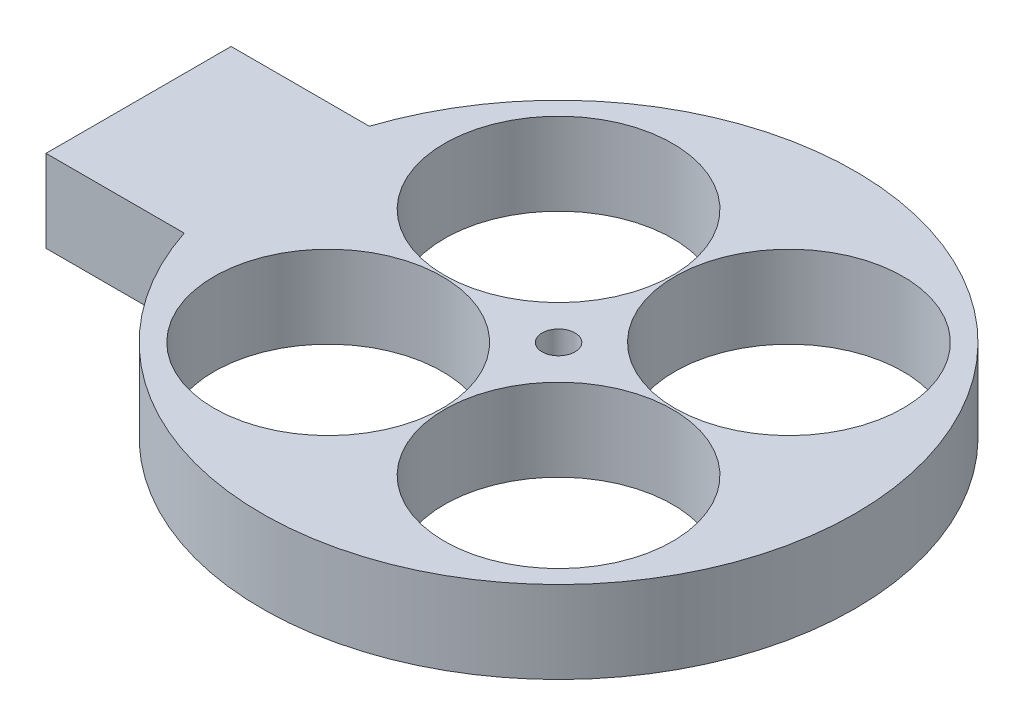
ISO-10303-21;
HEADER;
FILE_DESCRIPTION(('STEP AP214'),'2;1');
FILE_NAME('part.step','',(''),(''),'','','');
FILE_SCHEMA(('AUTOMOTIVE_DESIGN { 1 0 10303 214 1 1 1 1 }'));
ENDSEC;
DATA;
#1=APPLICATION_CONTEXT('core data for automotive mechanical design processes');
#2=APPLICATION_PROTOCOL_DEFINITION('international standard','automotive_design',2000,#1);
#3=PRODUCT_CONTEXT('',#1,'mechanical');
#4=PRODUCT('Part','Part','',(#3));
#5=PRODUCT_RELATED_PRODUCT_CATEGORY('part','',(#4));
#6=PRODUCT_DEFINITION_FORMATION('','',#4);
#7=PRODUCT_DEFINITION_CONTEXT('part definition',#1,'design');
#8=PRODUCT_DEFINITION('design','',#6,#7);
#9=PRODUCT_DEFINITION_SHAPE('','',#8);
#10=(LENGTH_UNIT() NAMED_UNIT(*) SI_UNIT(.MILLI.,.METRE.));
#11=(NAMED_UNIT(*) PLANE_ANGLE_UNIT() SI_UNIT($,.RADIAN.));
#12=(NAMED_UNIT(*) SI_UNIT($,.STERADIAN.) SOLID_ANGLE_UNIT());
#13=UNCERTAINTY_MEASURE_WITH_UNIT(LENGTH_MEASURE(1.E-05),#10,'distance_accuracy_value','');
#14=(GEOMETRIC_REPRESENTATION_CONTEXT(3) GLOBAL_UNCERTAINTY_ASSIGNED_CONTEXT((#13)) GLOBAL_UNIT_ASSIGNED_CONTEXT((#10,
#11,#12)) REPRESENTATION_CONTEXT('',''));
#15=CARTESIAN_POINT('',(0.,0.,0.));
#16=DIRECTION('',(0.,0.,1.));
#17=DIRECTION('',(1.,0.,0.));
#18=AXIS2_PLACEMENT_3D('',#15,#16,#17);
#19=CARTESIAN_POINT('',(0.,2.,0.));
#20=DIRECTION('',(0.,-1.,0.));
#21=DIRECTION('',(0.,0.,-1.));
#22=AXIS2_PLACEMENT_3D('',#19,#20,#21);
#23=CYLINDRICAL_SURFACE('',#22,14.4195959492893);
#24=DIRECTION('',(0.,-1.,0.));
#25=VECTOR('',#24,1.);
#26=CARTESIAN_POINT('',(-13.6994433222946,2.,4.5));
#27=LINE('',#26,#25);
#28=CARTESIAN_POINT('',(-13.6994433222946,-2.,4.5));
#29=VERTEX_POINT('',#28);
#30=CARTESIAN_POINT('',(-13.6994433222946,2.,4.5));
#31=VERTEX_POINT('',#30);
#32=EDGE_CURVE('E11',#29,#31,#27,.F.);
#33=ORIENTED_EDGE('',*,*,#32,.F.);
#34=CARTESIAN_POINT('',(0.,-2.,0.));
#35=DIRECTION('',(0.,1.,0.));
#36=DIRECTION('',(0.,0.,1.));
#37=AXIS2_PLACEMENT_3D('',#34,#35,#36);
#38=CIRCLE('',#37,14.4195959492893);
#39=CARTESIAN_POINT('',(-13.6994433222946,-2.,-4.5));
#40=VERTEX_POINT('',#39);
#41=EDGE_CURVE('E47',#29,#40,#38,.T.);
#42=ORIENTED_EDGE('',*,*,#41,.T.);
#43=DIRECTION('',(0.,-1.,0.));
#44=VECTOR('',#43,1.);
#45=CARTESIAN_POINT('',(-13.6994433222946,2.,-4.5));
#46=LINE('',#45,#44);
#47=CARTESIAN_POINT('',(-13.6994433222946,2.,-4.5));
#48=VERTEX_POINT('',#47);
#49=EDGE_CURVE('E40',#48,#40,#46,.T.);
#50=ORIENTED_EDGE('',*,*,#49,.F.);
#51=CARTESIAN_POINT('',(0.,2.,0.));
#52=DIRECTION('',(0.,1.,0.));
#53=DIRECTION('',(0.,0.,1.));
#54=AXIS2_PLACEMENT_3D('',#51,#52,#53);
#55=CIRCLE('',#54,14.4195959492893);
#56=EDGE_CURVE('E52',#31,#48,#55,.T.);
#57=ORIENTED_EDGE('',*,*,#56,.F.);
#58=EDGE_LOOP('',(#33,#42,#50,#57));
#59=FACE_BOUND('',#58,.T.);
#60=ADVANCED_FACE('F33',(#59),#23,.T.);
#61=CARTESIAN_POINT('',(0.,2.,0.));
#62=DIRECTION('',(0.,1.,0.));
#63=DIRECTION('',(0.,0.,1.));
#64=AXIS2_PLACEMENT_3D('',#61,#62,#63);
#65=PLANE('',#64);
#66=DIRECTION('',(1.,0.,0.));
#67=VECTOR('',#66,1.);
#68=CARTESIAN_POINT('',(-20.4195959492893,2.,4.5));
#69=LINE('',#68,#67);
#70=CARTESIAN_POINT('',(-20.4195959492893,2.,4.5));
#71=VERTEX_POINT('',#70);
#72=EDGE_CURVE('E71',#71,#31,#69,.T.);
#73=ORIENTED_EDGE('',*,*,#72,.T.);
#74=ORIENTED_EDGE('',*,*,#56,.T.);
#75=DIRECTION('',(-1.,0.,0.));
#76=VECTOR('',#75,1.);
#77=CARTESIAN_POINT('',(-12.9195959492893,2.,-4.5));
#78=LINE('',#77,#76);
#79=CARTESIAN_POINT('',(-20.4195959492893,2.,-4.5));
#80=VERTEX_POINT('',#79);
#81=EDGE_CURVE('E79',#48,#80,#78,.T.);
#82=ORIENTED_EDGE('',*,*,#81,.T.);
#83=DIRECTION('',(0.,0.,1.));
#84=VECTOR('',#83,1.);
#85=CARTESIAN_POINT('',(-20.4195959492893,2.,-4.5));
#86=LINE('',#85,#84);
#87=EDGE_CURVE('E80',#80,#71,#86,.T.);
#88=ORIENTED_EDGE('',*,*,#87,.T.);
#89=EDGE_LOOP('',(#73,#74,#82,#88));
#90=FACE_BOUND('',#89,.T.);
#91=CARTESIAN_POINT('',(5.6,2.,5.6));
#92=DIRECTION('',(0.,1.,0.));
#93=DIRECTION('',(0.,0.,1.));
#94=AXIS2_PLACEMENT_3D('',#91,#92,#93);
#95=CIRCLE('',#94,5.55);
#96=CARTESIAN_POINT('',(5.6,2.,11.15));
#97=VERTEX_POINT('',#96);
#98=EDGE_CURVE('E106',#97,#97,#95,.T.);
#99=ORIENTED_EDGE('',*,*,#98,.F.);
#100=EDGE_LOOP('',(#99));
#101=FACE_BOUND('',#100,.T.);
#102=CARTESIAN_POINT('',(-5.6,2.,-5.6));
#103=DIRECTION('',(0.,1.,0.));
#104=DIRECTION('',(0.,0.,1.));
#105=AXIS2_PLACEMENT_3D('',#102,#103,#104);
#106=CIRCLE('',#105,5.55);
#107=CARTESIAN_POINT('',(-5.6,2.,-0.0499999999999997));
#108=VERTEX_POINT('',#107);
#109=EDGE_CURVE('E118',#108,#108,#106,.T.);
#110=ORIENTED_EDGE('',*,*,#109,.F.);
#111=EDGE_LOOP('',(#110));
#112=FACE_BOUND('',#111,.T.);
#113=CARTESIAN_POINT('',(5.6,2.,-5.6));
#114=DIRECTION('',(0.,1.,0.));
#115=DIRECTION('',(0.,0.,1.));
#116=AXIS2_PLACEMENT_3D('',#113,#114,#115);
#117=CIRCLE('',#116,5.55);
#118=CARTESIAN_POINT('',(5.6,2.,-0.0499999999999997));
#119=VERTEX_POINT('',#118);
#120=EDGE_CURVE('E124',#119,#119,#117,.T.);
#121=ORIENTED_EDGE('',*,*,#120,.F.);
#122=EDGE_LOOP('',(#121));
#123=FACE_BOUND('',#122,.T.);
#124=CARTESIAN_POINT('',(-5.6,2.,5.6));
#125=DIRECTION('',(0.,1.,0.));
#126=DIRECTION('',(0.,0.,1.));
#127=AXIS2_PLACEMENT_3D('',#124,#125,#126);
#128=CIRCLE('',#127,5.55);
#129=CARTESIAN_POINT('',(-5.6,2.,11.15));
#130=VERTEX_POINT('',#129);
#131=EDGE_CURVE('E112',#130,#130,#128,.T.);
#132=ORIENTED_EDGE('',*,*,#131,.F.);
#133=EDGE_LOOP('',(#132));
#134=FACE_BOUND('',#133,.T.);
#135=CARTESIAN_POINT('',(0.,2.,0.));
#136=DIRECTION('',(0.,1.,0.));
#137=DIRECTION('',(0.,0.,1.));
#138=AXIS2_PLACEMENT_3D('',#135,#136,#137);
#139=CIRCLE('',#138,0.8);
#140=CARTESIAN_POINT('',(0.,2.,0.8));
#141=VERTEX_POINT('',#140);
#142=EDGE_CURVE('E98',#141,#141,#139,.T.);
#143=ORIENTED_EDGE('',*,*,#142,.F.);
#144=EDGE_LOOP('',(#143));
#145=FACE_BOUND('',#144,.T.);
#146=ADVANCED_FACE('F83',(#90,#101,#112,#123,#134,#145),#65,.T.);
#147=CARTESIAN_POINT('',(0.,-2.,0.));
#148=DIRECTION('',(0.,1.,0.));
#149=DIRECTION('',(0.,0.,1.));
#150=AXIS2_PLACEMENT_3D('',#147,#148,#149);
#151=PLANE('',#150);
#152=ORIENTED_EDGE('',*,*,#41,.F.);
#153=DIRECTION('',(1.,0.,0.));
#154=VECTOR('',#153,1.);
#155=CARTESIAN_POINT('',(-20.4195959492893,-2.,4.5));
#156=LINE('',#155,#154);
#157=CARTESIAN_POINT('',(-20.4195959492893,-2.,4.5));
#158=VERTEX_POINT('',#157);
#159=EDGE_CURVE('E136',#158,#29,#156,.T.);
#160=ORIENTED_EDGE('',*,*,#159,.F.);
#161=DIRECTION('',(0.,0.,1.));
#162=VECTOR('',#161,1.);
#163=CARTESIAN_POINT('',(-20.4195959492893,-2.,-4.5));
#164=LINE('',#163,#162);
#165=CARTESIAN_POINT('',(-20.4195959492893,-2.,-4.5));
#166=VERTEX_POINT('',#165);
#167=EDGE_CURVE('E93',#166,#158,#164,.T.);
#168=ORIENTED_EDGE('',*,*,#167,.F.);
#169=DIRECTION('',(-1.,0.,0.));
#170=VECTOR('',#169,1.);
#171=CARTESIAN_POINT('',(-12.9195959492893,-2.,-4.5));
#172=LINE('',#171,#170);
#173=EDGE_CURVE('E89',#40,#166,#172,.T.);
#174=ORIENTED_EDGE('',*,*,#173,.F.);
#175=EDGE_LOOP('',(#152,#160,#168,#174));
#176=FACE_BOUND('',#175,.T.);
#177=CARTESIAN_POINT('',(0.,-2.,0.));
#178=DIRECTION('',(0.,1.,0.));
#179=DIRECTION('',(0.,0.,1.));
#180=AXIS2_PLACEMENT_3D('',#177,#178,#179);
#181=CIRCLE('',#180,0.8);
#182=CARTESIAN_POINT('',(0.,-2.,0.8));
#183=VERTEX_POINT('',#182);
#184=EDGE_CURVE('E94',#183,#183,#181,.T.);
#185=ORIENTED_EDGE('',*,*,#184,.T.);
#186=EDGE_LOOP('',(#185));
#187=FACE_BOUND('',#186,.T.);
#188=CARTESIAN_POINT('',(5.6,-2.,5.6));
#189=DIRECTION('',(0.,1.,0.));
#190=DIRECTION('',(0.,0.,1.));
#191=AXIS2_PLACEMENT_3D('',#188,#189,#190);
#192=CIRCLE('',#191,5.55);
#193=CARTESIAN_POINT('',(5.6,-2.,11.15));
#194=VERTEX_POINT('',#193);
#195=EDGE_CURVE('E104',#194,#194,#192,.T.);
#196=ORIENTED_EDGE('',*,*,#195,.T.);
#197=EDGE_LOOP('',(#196));
#198=FACE_BOUND('',#197,.T.);
#199=CARTESIAN_POINT('',(-5.6,-2.,5.6));
#200=DIRECTION('',(0.,1.,0.));
#201=DIRECTION('',(0.,0.,1.));
#202=AXIS2_PLACEMENT_3D('',#199,#200,#201);
#203=CIRCLE('',#202,5.55);
#204=CARTESIAN_POINT('',(-5.6,-2.,11.15));
#205=VERTEX_POINT('',#204);
#206=EDGE_CURVE('E109',#205,#205,#203,.T.);
#207=ORIENTED_EDGE('',*,*,#206,.T.);
#208=EDGE_LOOP('',(#207));
#209=FACE_BOUND('',#208,.T.);
#210=CARTESIAN_POINT('',(-5.6,-2.,-5.6));
#211=DIRECTION('',(0.,1.,0.));
#212=DIRECTION('',(0.,0.,1.));
#213=AXIS2_PLACEMENT_3D('',#210,#211,#212);
#214=CIRCLE('',#213,5.55);
#215=CARTESIAN_POINT('',(-5.6,-2.,-0.0499999999999997));
#216=VERTEX_POINT('',#215);
#217=EDGE_CURVE('E115',#216,#216,#214,.T.);
#218=ORIENTED_EDGE('',*,*,#217,.T.);
#219=EDGE_LOOP('',(#218));
#220=FACE_BOUND('',#219,.T.);
#221=CARTESIAN_POINT('',(5.6,-2.,-5.6));
#222=DIRECTION('',(0.,1.,0.));
#223=DIRECTION('',(0.,0.,1.));
#224=AXIS2_PLACEMENT_3D('',#221,#222,#223);
#225=CIRCLE('',#224,5.55);
#226=CARTESIAN_POINT('',(5.6,-2.,-0.0499999999999997));
#227=VERTEX_POINT('',#226);
#228=EDGE_CURVE('E121',#227,#227,#225,.T.);
#229=ORIENTED_EDGE('',*,*,#228,.T.);
#230=EDGE_LOOP('',(#229));
#231=FACE_BOUND('',#230,.T.);
#232=ADVANCED_FACE('F134',(#176,#187,#198,#209,#220,#231),#151,.F.);
#233=CARTESIAN_POINT('',(5.6,2.,-5.6));
#234=DIRECTION('',(0.,-1.,0.));
#235=DIRECTION('',(0.,0.,-1.));
#236=AXIS2_PLACEMENT_3D('',#233,#234,#235);
#237=CYLINDRICAL_SURFACE('',#236,5.55);
#238=ORIENTED_EDGE('',*,*,#120,.T.);
#239=EDGE_LOOP('',(#238));
#240=FACE_BOUND('',#239,.T.);
#241=ORIENTED_EDGE('',*,*,#228,.F.);
#242=EDGE_LOOP('',(#241));
#243=FACE_BOUND('',#242,.T.);
#244=ADVANCED_FACE('F148',(#240,#243),#237,.F.);
#245=CARTESIAN_POINT('',(-5.6,2.,-5.6));
#246=DIRECTION('',(0.,-1.,0.));
#247=DIRECTION('',(0.,0.,-1.));
#248=AXIS2_PLACEMENT_3D('',#245,#246,#247);
#249=CYLINDRICAL_SURFACE('',#248,5.55);
#250=ORIENTED_EDGE('',*,*,#109,.T.);
#251=EDGE_LOOP('',(#250));
#252=FACE_BOUND('',#251,.T.);
#253=ORIENTED_EDGE('',*,*,#217,.F.);
#254=EDGE_LOOP('',(#253));
#255=FACE_BOUND('',#254,.T.);
#256=ADVANCED_FACE('F152',(#252,#255),#249,.F.);
#257=CARTESIAN_POINT('',(-5.6,2.,5.6));
#258=DIRECTION('',(0.,-1.,0.));
#259=DIRECTION('',(0.,0.,-1.));
#260=AXIS2_PLACEMENT_3D('',#257,#258,#259);
#261=CYLINDRICAL_SURFACE('',#260,5.55);
#262=ORIENTED_EDGE('',*,*,#131,.T.);
#263=EDGE_LOOP('',(#262));
#264=FACE_BOUND('',#263,.T.);
#265=ORIENTED_EDGE('',*,*,#206,.F.);
#266=EDGE_LOOP('',(#265));
#267=FACE_BOUND('',#266,.T.);
#268=ADVANCED_FACE('F156',(#264,#267),#261,.F.);
#269=CARTESIAN_POINT('',(5.6,2.,5.6));
#270=DIRECTION('',(0.,-1.,0.));
#271=DIRECTION('',(0.,0.,-1.));
#272=AXIS2_PLACEMENT_3D('',#269,#270,#271);
#273=CYLINDRICAL_SURFACE('',#272,5.55);
#274=ORIENTED_EDGE('',*,*,#98,.T.);
#275=EDGE_LOOP('',(#274));
#276=FACE_BOUND('',#275,.T.);
#277=ORIENTED_EDGE('',*,*,#195,.F.);
#278=EDGE_LOOP('',(#277));
#279=FACE_BOUND('',#278,.T.);
#280=ADVANCED_FACE('F160',(#276,#279),#273,.F.);
#281=CARTESIAN_POINT('',(0.,2.,0.));
#282=DIRECTION('',(0.,-1.,0.));
#283=DIRECTION('',(0.,0.,-1.));
#284=AXIS2_PLACEMENT_3D('',#281,#282,#283);
#285=CYLINDRICAL_SURFACE('',#284,0.8);
#286=ORIENTED_EDGE('',*,*,#142,.T.);
#287=EDGE_LOOP('',(#286));
#288=FACE_BOUND('',#287,.T.);
#289=ORIENTED_EDGE('',*,*,#184,.F.);
#290=EDGE_LOOP('',(#289));
#291=FACE_BOUND('',#290,.T.);
#292=ADVANCED_FACE('F164',(#288,#291),#285,.F.);
#293=CARTESIAN_POINT('',(-20.4195959492893,2.,4.5));
#294=DIRECTION('',(0.,0.,-1.));
#295=DIRECTION('',(-1.,0.,0.));
#296=AXIS2_PLACEMENT_3D('',#293,#294,#295);
#297=PLANE('',#296);
#298=ORIENTED_EDGE('',*,*,#159,.T.);
#299=ORIENTED_EDGE('',*,*,#32,.T.);
#300=ORIENTED_EDGE('',*,*,#72,.F.);
#301=DIRECTION('',(0.,-1.,0.));
#302=VECTOR('',#301,1.);
#303=CARTESIAN_POINT('',(-20.4195959492893,2.,4.5));
#304=LINE('',#303,#302);
#305=EDGE_CURVE('E76',#71,#158,#304,.T.);
#306=ORIENTED_EDGE('',*,*,#305,.T.);
#307=EDGE_LOOP('',(#298,#299,#300,#306));
#308=FACE_BOUND('',#307,.T.);
#309=ADVANCED_FACE('F74',(#308),#297,.F.);
#310=CARTESIAN_POINT('',(-12.9195959492893,2.,-4.5));
#311=DIRECTION('',(0.,0.,1.));
#312=DIRECTION('',(1.,0.,0.));
#313=AXIS2_PLACEMENT_3D('',#310,#311,#312);
#314=PLANE('',#313);
#315=ORIENTED_EDGE('',*,*,#81,.F.);
#316=ORIENTED_EDGE('',*,*,#49,.T.);
#317=ORIENTED_EDGE('',*,*,#173,.T.);
#318=DIRECTION('',(0.,-1.,0.));
#319=VECTOR('',#318,1.);
#320=CARTESIAN_POINT('',(-20.4195959492893,2.,-4.5));
#321=LINE('',#320,#319);
#322=EDGE_CURVE('E95',#80,#166,#321,.T.);
#323=ORIENTED_EDGE('',*,*,#322,.F.);
#324=EDGE_LOOP('',(#315,#316,#317,#323));
#325=FACE_BOUND('',#324,.T.);
#326=ADVANCED_FACE('F132',(#325),#314,.F.);
#327=CARTESIAN_POINT('',(-20.4195959492893,2.,-4.5));
#328=DIRECTION('',(1.,0.,0.));
#329=DIRECTION('',(0.,0.,-1.));
#330=AXIS2_PLACEMENT_3D('',#327,#328,#329);
#331=PLANE('',#330);
#332=ORIENTED_EDGE('',*,*,#167,.T.);
#333=ORIENTED_EDGE('',*,*,#305,.F.);
#334=ORIENTED_EDGE('',*,*,#87,.F.);
#335=ORIENTED_EDGE('',*,*,#322,.T.);
#336=EDGE_LOOP('',(#332,#333,#334,#335));
#337=FACE_BOUND('',#336,.T.);
#338=ADVANCED_FACE('F91',(#337),#331,.F.);
#339=CLOSED_SHELL('',(#60,#146,#232,#244,#256,#268,#280,#292,#309,#326,#338));
#340=MANIFOLD_SOLID_BREP('B2',#339);
#341=ADVANCED_BREP_SHAPE_REPRESENTATION('',(#18,#340),#14);
#342=SHAPE_DEFINITION_REPRESENTATION(#9,#341);
ENDSEC;
END-ISO-10303-21;
